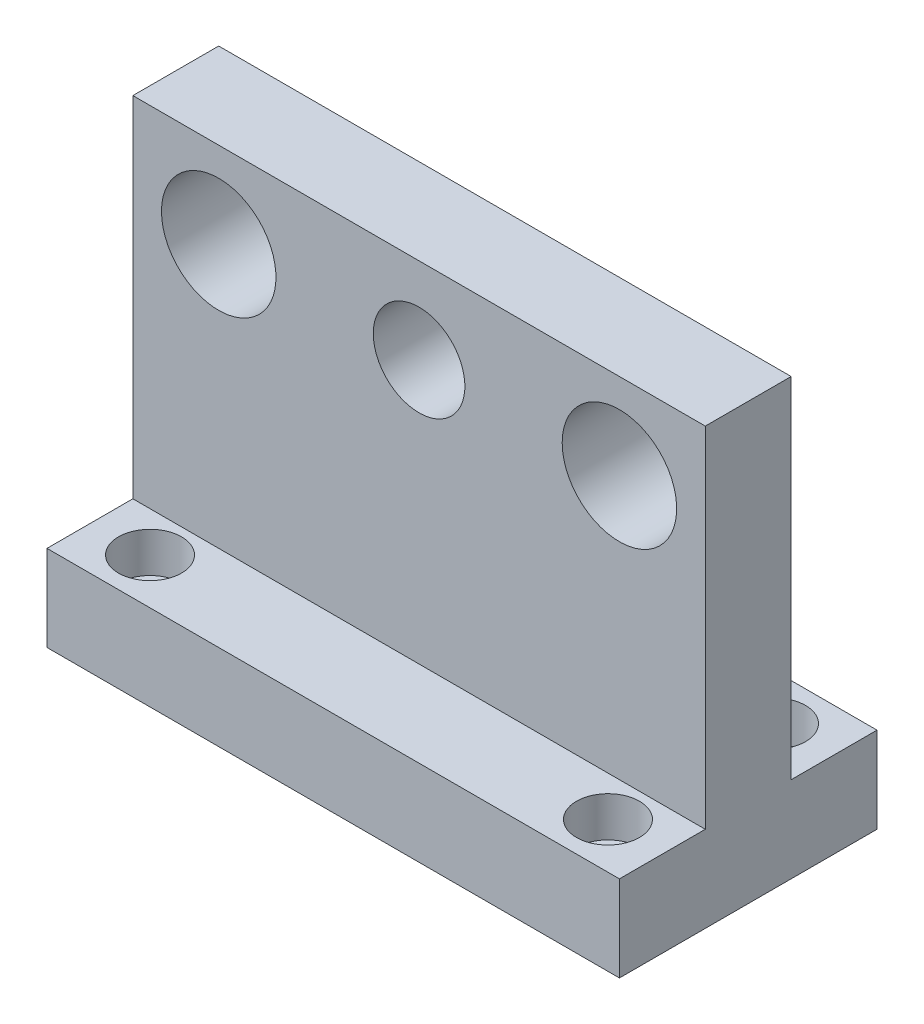
ISO-10303-21;
HEADER;
FILE_DESCRIPTION(('STEP AP214'),'2;1');
FILE_NAME('part.step','',(''),(''),'','','');
FILE_SCHEMA(('AUTOMOTIVE_DESIGN { 1 0 10303 214 1 1 1 1 }'));
ENDSEC;
DATA;
#1=APPLICATION_CONTEXT('core data for automotive mechanical design processes');
#2=APPLICATION_PROTOCOL_DEFINITION('international standard','automotive_design',2000,#1);
#3=PRODUCT_CONTEXT('',#1,'mechanical');
#4=PRODUCT('Part','Part','',(#3));
#5=PRODUCT_RELATED_PRODUCT_CATEGORY('part','',(#4));
#6=PRODUCT_DEFINITION_FORMATION('','',#4);
#7=PRODUCT_DEFINITION_CONTEXT('part definition',#1,'design');
#8=PRODUCT_DEFINITION('design','',#6,#7);
#9=PRODUCT_DEFINITION_SHAPE('','',#8);
#10=(LENGTH_UNIT() NAMED_UNIT(*) SI_UNIT(.MILLI.,.METRE.));
#11=(NAMED_UNIT(*) PLANE_ANGLE_UNIT() SI_UNIT($,.RADIAN.));
#12=(NAMED_UNIT(*) SI_UNIT($,.STERADIAN.) SOLID_ANGLE_UNIT());
#13=UNCERTAINTY_MEASURE_WITH_UNIT(LENGTH_MEASURE(1.E-05),#10,'distance_accuracy_value','');
#14=(GEOMETRIC_REPRESENTATION_CONTEXT(3) GLOBAL_UNCERTAINTY_ASSIGNED_CONTEXT((#13)) GLOBAL_UNIT_ASSIGNED_CONTEXT((#10,
#11,#12)) REPRESENTATION_CONTEXT('',''));
#15=CARTESIAN_POINT('',(0.,0.,0.));
#16=DIRECTION('',(0.,0.,1.));
#17=DIRECTION('',(1.,0.,0.));
#18=AXIS2_PLACEMENT_3D('',#15,#16,#17);
#19=CARTESIAN_POINT('',(90.,-15.,22.));
#20=DIRECTION('',(0.,1.,0.));
#21=DIRECTION('',(0.,0.,1.));
#22=AXIS2_PLACEMENT_3D('',#19,#20,#21);
#23=CYLINDRICAL_SURFACE('',#22,3.50000000000001);
#24=CARTESIAN_POINT('',(90.,-15.,22.));
#25=DIRECTION('',(0.,1.,0.));
#26=DIRECTION('',(0.,0.,-1.));
#27=AXIS2_PLACEMENT_3D('',#24,#25,#26);
#28=CIRCLE('',#27,3.50000000000001);
#29=CARTESIAN_POINT('',(90.,-15.,18.5));
#30=VERTEX_POINT('',#29);
#31=EDGE_CURVE('E247',#30,#30,#28,.T.);
#32=ORIENTED_EDGE('',*,*,#31,.F.);
#33=EDGE_LOOP('',(#32));
#34=FACE_BOUND('',#33,.T.);
#35=CARTESIAN_POINT('',(90.,-7.,22.));
#36=DIRECTION('',(0.,1.,0.));
#37=DIRECTION('',(0.,0.,1.));
#38=AXIS2_PLACEMENT_3D('',#35,#36,#37);
#39=CIRCLE('',#38,3.50000000000001);
#40=CARTESIAN_POINT('',(90.,-7.,25.5));
#41=VERTEX_POINT('',#40);
#42=EDGE_CURVE('E40',#41,#41,#39,.F.);
#43=ORIENTED_EDGE('',*,*,#42,.F.);
#44=EDGE_LOOP('',(#43));
#45=FACE_BOUND('',#44,.T.);
#46=ADVANCED_FACE('F36',(#34,#45),#23,.F.);
#47=CARTESIAN_POINT('',(10.,-15.,22.));
#48=DIRECTION('',(0.,1.,0.));
#49=DIRECTION('',(0.,0.,1.));
#50=AXIS2_PLACEMENT_3D('',#47,#48,#49);
#51=CYLINDRICAL_SURFACE('',#50,3.5);
#52=CARTESIAN_POINT('',(10.,-15.,22.));
#53=DIRECTION('',(0.,1.,0.));
#54=DIRECTION('',(0.,0.,-1.));
#55=AXIS2_PLACEMENT_3D('',#52,#53,#54);
#56=CIRCLE('',#55,3.5);
#57=CARTESIAN_POINT('',(10.,-15.,18.5));
#58=VERTEX_POINT('',#57);
#59=EDGE_CURVE('E244',#58,#58,#56,.T.);
#60=ORIENTED_EDGE('',*,*,#59,.F.);
#61=EDGE_LOOP('',(#60));
#62=FACE_BOUND('',#61,.T.);
#63=CARTESIAN_POINT('',(10.,-7.,22.));
#64=DIRECTION('',(0.,1.,0.));
#65=DIRECTION('',(0.,0.,1.));
#66=AXIS2_PLACEMENT_3D('',#63,#64,#65);
#67=CIRCLE('',#66,3.5);
#68=CARTESIAN_POINT('',(10.,-7.,25.5));
#69=VERTEX_POINT('',#68);
#70=EDGE_CURVE('E259',#69,#69,#67,.F.);
#71=ORIENTED_EDGE('',*,*,#70,.F.);
#72=EDGE_LOOP('',(#71));
#73=FACE_BOUND('',#72,.T.);
#74=ADVANCED_FACE('F216',(#62,#73),#51,.F.);
#75=CARTESIAN_POINT('',(90.,-15.,-7.));
#76=DIRECTION('',(0.,1.,0.));
#77=DIRECTION('',(0.,0.,1.));
#78=AXIS2_PLACEMENT_3D('',#75,#76,#77);
#79=CYLINDRICAL_SURFACE('',#78,3.50000000000001);
#80=CARTESIAN_POINT('',(90.,-15.,-7.));
#81=DIRECTION('',(0.,1.,0.));
#82=DIRECTION('',(0.,0.,1.));
#83=AXIS2_PLACEMENT_3D('',#80,#81,#82);
#84=CIRCLE('',#83,3.50000000000001);
#85=CARTESIAN_POINT('',(90.,-15.,-3.49999999999999));
#86=VERTEX_POINT('',#85);
#87=EDGE_CURVE('E283',#86,#86,#84,.T.);
#88=ORIENTED_EDGE('',*,*,#87,.F.);
#89=EDGE_LOOP('',(#88));
#90=FACE_BOUND('',#89,.T.);
#91=CARTESIAN_POINT('',(90.,-7.,-7.));
#92=DIRECTION('',(0.,1.,0.));
#93=DIRECTION('',(0.,0.,1.));
#94=AXIS2_PLACEMENT_3D('',#91,#92,#93);
#95=CIRCLE('',#94,3.50000000000001);
#96=CARTESIAN_POINT('',(90.,-7.,-3.49999999999999));
#97=VERTEX_POINT('',#96);
#98=EDGE_CURVE('E256',#97,#97,#95,.F.);
#99=ORIENTED_EDGE('',*,*,#98,.F.);
#100=EDGE_LOOP('',(#99));
#101=FACE_BOUND('',#100,.T.);
#102=ADVANCED_FACE('F222',(#90,#101),#79,.F.);
#103=CARTESIAN_POINT('',(10.,-15.,-7.));
#104=DIRECTION('',(0.,1.,0.));
#105=DIRECTION('',(0.,0.,1.));
#106=AXIS2_PLACEMENT_3D('',#103,#104,#105);
#107=CYLINDRICAL_SURFACE('',#106,3.5);
#108=CARTESIAN_POINT('',(10.,-15.,-7.));
#109=DIRECTION('',(0.,1.,0.));
#110=DIRECTION('',(0.,0.,1.));
#111=AXIS2_PLACEMENT_3D('',#108,#109,#110);
#112=CIRCLE('',#111,3.5);
#113=CARTESIAN_POINT('',(10.,-15.,-3.5));
#114=VERTEX_POINT('',#113);
#115=EDGE_CURVE('E178',#114,#114,#112,.T.);
#116=ORIENTED_EDGE('',*,*,#115,.F.);
#117=EDGE_LOOP('',(#116));
#118=FACE_BOUND('',#117,.T.);
#119=CARTESIAN_POINT('',(10.,-7.,-7.));
#120=DIRECTION('',(0.,1.,0.));
#121=DIRECTION('',(0.,0.,1.));
#122=AXIS2_PLACEMENT_3D('',#119,#120,#121);
#123=CIRCLE('',#122,3.5);
#124=CARTESIAN_POINT('',(10.,-7.,-3.5));
#125=VERTEX_POINT('',#124);
#126=EDGE_CURVE('E242',#125,#125,#123,.F.);
#127=ORIENTED_EDGE('',*,*,#126,.F.);
#128=EDGE_LOOP('',(#127));
#129=FACE_BOUND('',#128,.T.);
#130=ADVANCED_FACE('F230',(#118,#129),#107,.F.);
#131=CARTESIAN_POINT('',(0.,0.,15.));
#132=DIRECTION('',(1.,0.,0.));
#133=DIRECTION('',(0.,0.,-1.));
#134=AXIS2_PLACEMENT_3D('',#131,#132,#133);
#135=PLANE('',#134);
#136=DIRECTION('',(0.,-1.,0.));
#137=VECTOR('',#136,1.);
#138=CARTESIAN_POINT('',(0.,0.,0.));
#139=LINE('',#138,#137);
#140=CARTESIAN_POINT('',(0.,61.,0.));
#141=VERTEX_POINT('',#140);
#142=CARTESIAN_POINT('',(0.,0.,0.));
#143=VERTEX_POINT('',#142);
#144=EDGE_CURVE('E118',#141,#143,#139,.T.);
#145=ORIENTED_EDGE('',*,*,#144,.T.);
#146=DIRECTION('',(0.,0.,-1.));
#147=VECTOR('',#146,1.);
#148=CARTESIAN_POINT('',(0.,0.,30.));
#149=LINE('',#148,#147);
#150=CARTESIAN_POINT('',(0.,0.,-15.));
#151=VERTEX_POINT('',#150);
#152=EDGE_CURVE('E149',#143,#151,#149,.T.);
#153=ORIENTED_EDGE('',*,*,#152,.T.);
#154=DIRECTION('',(0.,1.,0.));
#155=VECTOR('',#154,1.);
#156=CARTESIAN_POINT('',(0.,-15.,-15.));
#157=LINE('',#156,#155);
#158=CARTESIAN_POINT('',(0.,-15.,-15.));
#159=VERTEX_POINT('',#158);
#160=EDGE_CURVE('E132',#159,#151,#157,.T.);
#161=ORIENTED_EDGE('',*,*,#160,.F.);
#162=DIRECTION('',(0.,0.,-1.));
#163=VECTOR('',#162,1.);
#164=CARTESIAN_POINT('',(0.,-15.,30.));
#165=LINE('',#164,#163);
#166=CARTESIAN_POINT('',(0.,-15.,30.));
#167=VERTEX_POINT('',#166);
#168=EDGE_CURVE('E162',#167,#159,#165,.T.);
#169=ORIENTED_EDGE('',*,*,#168,.F.);
#170=DIRECTION('',(0.,1.,0.));
#171=VECTOR('',#170,1.);
#172=CARTESIAN_POINT('',(0.,-15.,30.));
#173=LINE('',#172,#171);
#174=CARTESIAN_POINT('',(0.,0.,30.));
#175=VERTEX_POINT('',#174);
#176=EDGE_CURVE('E183',#167,#175,#173,.T.);
#177=ORIENTED_EDGE('',*,*,#176,.T.);
#178=CARTESIAN_POINT('',(0.,0.,15.));
#179=VERTEX_POINT('',#178);
#180=EDGE_CURVE('E146',#175,#179,#149,.T.);
#181=ORIENTED_EDGE('',*,*,#180,.T.);
#182=DIRECTION('',(0.,-1.,0.));
#183=VECTOR('',#182,1.);
#184=CARTESIAN_POINT('',(0.,0.,15.));
#185=LINE('',#184,#183);
#186=CARTESIAN_POINT('',(0.,61.,15.));
#187=VERTEX_POINT('',#186);
#188=EDGE_CURVE('E103',#187,#179,#185,.T.);
#189=ORIENTED_EDGE('',*,*,#188,.F.);
#190=DIRECTION('',(0.,0.,-1.));
#191=VECTOR('',#190,1.);
#192=CARTESIAN_POINT('',(0.,61.,15.));
#193=LINE('',#192,#191);
#194=EDGE_CURVE('E46',#187,#141,#193,.T.);
#195=ORIENTED_EDGE('',*,*,#194,.T.);
#196=EDGE_LOOP('',(#145,#153,#161,#169,#177,#181,#189,#195));
#197=FACE_BOUND('',#196,.T.);
#198=ADVANCED_FACE('F38',(#197),#135,.F.);
#199=CARTESIAN_POINT('',(100.,0.,15.));
#200=DIRECTION('',(-1.,0.,0.));
#201=DIRECTION('',(0.,0.,1.));
#202=AXIS2_PLACEMENT_3D('',#199,#200,#201);
#203=PLANE('',#202);
#204=DIRECTION('',(0.,1.,0.));
#205=VECTOR('',#204,1.);
#206=CARTESIAN_POINT('',(100.,0.,0.));
#207=LINE('',#206,#205);
#208=CARTESIAN_POINT('',(100.,0.,0.));
#209=VERTEX_POINT('',#208);
#210=CARTESIAN_POINT('',(100.,61.,0.));
#211=VERTEX_POINT('',#210);
#212=EDGE_CURVE('E67',#209,#211,#207,.T.);
#213=ORIENTED_EDGE('',*,*,#212,.T.);
#214=DIRECTION('',(0.,0.,-1.));
#215=VECTOR('',#214,1.);
#216=CARTESIAN_POINT('',(100.,61.,15.));
#217=LINE('',#216,#215);
#218=CARTESIAN_POINT('',(100.,61.,15.));
#219=VERTEX_POINT('',#218);
#220=EDGE_CURVE('E11',#219,#211,#217,.T.);
#221=ORIENTED_EDGE('',*,*,#220,.F.);
#222=DIRECTION('',(0.,1.,0.));
#223=VECTOR('',#222,1.);
#224=CARTESIAN_POINT('',(100.,0.,15.));
#225=LINE('',#224,#223);
#226=CARTESIAN_POINT('',(100.,0.,15.));
#227=VERTEX_POINT('',#226);
#228=EDGE_CURVE('E101',#227,#219,#225,.T.);
#229=ORIENTED_EDGE('',*,*,#228,.F.);
#230=DIRECTION('',(0.,0.,1.));
#231=VECTOR('',#230,1.);
#232=CARTESIAN_POINT('',(100.,0.,30.));
#233=LINE('',#232,#231);
#234=CARTESIAN_POINT('',(100.,0.,30.));
#235=VERTEX_POINT('',#234);
#236=EDGE_CURVE('E85',#227,#235,#233,.T.);
#237=ORIENTED_EDGE('',*,*,#236,.T.);
#238=DIRECTION('',(0.,1.,0.));
#239=VECTOR('',#238,1.);
#240=CARTESIAN_POINT('',(100.,-15.,30.));
#241=LINE('',#240,#239);
#242=CARTESIAN_POINT('',(100.,-15.,30.));
#243=VERTEX_POINT('',#242);
#244=EDGE_CURVE('E142',#243,#235,#241,.T.);
#245=ORIENTED_EDGE('',*,*,#244,.F.);
#246=DIRECTION('',(0.,0.,1.));
#247=VECTOR('',#246,1.);
#248=CARTESIAN_POINT('',(100.,-15.,30.));
#249=LINE('',#248,#247);
#250=CARTESIAN_POINT('',(100.,-15.,-15.));
#251=VERTEX_POINT('',#250);
#252=EDGE_CURVE('E175',#251,#243,#249,.T.);
#253=ORIENTED_EDGE('',*,*,#252,.F.);
#254=DIRECTION('',(0.,1.,0.));
#255=VECTOR('',#254,1.);
#256=CARTESIAN_POINT('',(100.,-15.,-15.));
#257=LINE('',#256,#255);
#258=CARTESIAN_POINT('',(100.,0.,-15.));
#259=VERTEX_POINT('',#258);
#260=EDGE_CURVE('E134',#251,#259,#257,.T.);
#261=ORIENTED_EDGE('',*,*,#260,.T.);
#262=EDGE_CURVE('E97',#259,#209,#233,.T.);
#263=ORIENTED_EDGE('',*,*,#262,.T.);
#264=EDGE_LOOP('',(#213,#221,#229,#237,#245,#253,#261,#263));
#265=FACE_BOUND('',#264,.T.);
#266=ADVANCED_FACE('F105',(#265),#203,.F.);
#267=CARTESIAN_POINT('',(0.,61.,15.));
#268=DIRECTION('',(0.,-1.,0.));
#269=DIRECTION('',(0.,0.,-1.));
#270=AXIS2_PLACEMENT_3D('',#267,#268,#269);
#271=PLANE('',#270);
#272=DIRECTION('',(-1.,0.,0.));
#273=VECTOR('',#272,1.);
#274=CARTESIAN_POINT('',(0.,61.,0.));
#275=LINE('',#274,#273);
#276=EDGE_CURVE('E113',#211,#141,#275,.T.);
#277=ORIENTED_EDGE('',*,*,#276,.T.);
#278=ORIENTED_EDGE('',*,*,#194,.F.);
#279=DIRECTION('',(-1.,0.,0.));
#280=VECTOR('',#279,1.);
#281=CARTESIAN_POINT('',(0.,61.,15.));
#282=LINE('',#281,#280);
#283=EDGE_CURVE('E55',#219,#187,#282,.T.);
#284=ORIENTED_EDGE('',*,*,#283,.F.);
#285=ORIENTED_EDGE('',*,*,#220,.T.);
#286=EDGE_LOOP('',(#277,#278,#284,#285));
#287=FACE_BOUND('',#286,.T.);
#288=ADVANCED_FACE('F302',(#287),#271,.F.);
#289=CARTESIAN_POINT('',(0.,0.,15.));
#290=DIRECTION('',(0.,0.,-1.));
#291=DIRECTION('',(-1.,0.,0.));
#292=AXIS2_PLACEMENT_3D('',#289,#290,#291);
#293=PLANE('',#292);
#294=CARTESIAN_POINT('',(50.,46.,15.));
#295=DIRECTION('',(0.,0.,-1.));
#296=DIRECTION('',(-1.,0.,0.));
#297=AXIS2_PLACEMENT_3D('',#294,#295,#296);
#298=CIRCLE('',#297,8.);
#299=CARTESIAN_POINT('',(42.,46.,15.));
#300=VERTEX_POINT('',#299);
#301=EDGE_CURVE('E552',#300,#300,#298,.T.);
#302=ORIENTED_EDGE('',*,*,#301,.T.);
#303=EDGE_LOOP('',(#302));
#304=FACE_BOUND('',#303,.T.);
#305=CARTESIAN_POINT('',(15.,46.,15.));
#306=DIRECTION('',(0.,0.,-1.));
#307=DIRECTION('',(-1.,0.,0.));
#308=AXIS2_PLACEMENT_3D('',#305,#306,#307);
#309=CIRCLE('',#308,10.);
#310=CARTESIAN_POINT('',(5.,46.,15.));
#311=VERTEX_POINT('',#310);
#312=EDGE_CURVE('E556',#311,#311,#309,.T.);
#313=ORIENTED_EDGE('',*,*,#312,.T.);
#314=EDGE_LOOP('',(#313));
#315=FACE_BOUND('',#314,.T.);
#316=CARTESIAN_POINT('',(85.,46.,15.));
#317=DIRECTION('',(0.,0.,-1.));
#318=DIRECTION('',(-1.,0.,0.));
#319=AXIS2_PLACEMENT_3D('',#316,#317,#318);
#320=CIRCLE('',#319,9.99999999999999);
#321=CARTESIAN_POINT('',(75.,46.,15.));
#322=VERTEX_POINT('',#321);
#323=EDGE_CURVE('E565',#322,#322,#320,.T.);
#324=ORIENTED_EDGE('',*,*,#323,.T.);
#325=EDGE_LOOP('',(#324));
#326=FACE_BOUND('',#325,.T.);
#327=ORIENTED_EDGE('',*,*,#188,.T.);
#328=DIRECTION('',(1.,0.,0.));
#329=VECTOR('',#328,1.);
#330=CARTESIAN_POINT('',(0.,0.,15.));
#331=LINE('',#330,#329);
#332=EDGE_CURVE('E89',#179,#227,#331,.T.);
#333=ORIENTED_EDGE('',*,*,#332,.T.);
#334=ORIENTED_EDGE('',*,*,#228,.T.);
#335=ORIENTED_EDGE('',*,*,#283,.T.);
#336=EDGE_LOOP('',(#327,#333,#334,#335));
#337=FACE_BOUND('',#336,.T.);
#338=ADVANCED_FACE('F100',(#304,#315,#326,#337),#293,.F.);
#339=CARTESIAN_POINT('',(0.,0.,0.));
#340=DIRECTION('',(0.,0.,-1.));
#341=DIRECTION('',(-1.,0.,0.));
#342=AXIS2_PLACEMENT_3D('',#339,#340,#341);
#343=PLANE('',#342);
#344=CARTESIAN_POINT('',(50.,46.,0.));
#345=DIRECTION('',(0.,0.,-1.));
#346=DIRECTION('',(-1.,0.,0.));
#347=AXIS2_PLACEMENT_3D('',#344,#345,#346);
#348=CIRCLE('',#347,8.);
#349=CARTESIAN_POINT('',(42.,46.,0.));
#350=VERTEX_POINT('',#349);
#351=EDGE_CURVE('E549',#350,#350,#348,.T.);
#352=ORIENTED_EDGE('',*,*,#351,.F.);
#353=EDGE_LOOP('',(#352));
#354=FACE_BOUND('',#353,.T.);
#355=CARTESIAN_POINT('',(15.,46.,0.));
#356=DIRECTION('',(0.,0.,-1.));
#357=DIRECTION('',(-1.,0.,0.));
#358=AXIS2_PLACEMENT_3D('',#355,#356,#357);
#359=CIRCLE('',#358,10.);
#360=CARTESIAN_POINT('',(5.,46.,0.));
#361=VERTEX_POINT('',#360);
#362=EDGE_CURVE('E553',#361,#361,#359,.T.);
#363=ORIENTED_EDGE('',*,*,#362,.F.);
#364=EDGE_LOOP('',(#363));
#365=FACE_BOUND('',#364,.T.);
#366=CARTESIAN_POINT('',(85.,46.,0.));
#367=DIRECTION('',(0.,0.,-1.));
#368=DIRECTION('',(-1.,0.,0.));
#369=AXIS2_PLACEMENT_3D('',#366,#367,#368);
#370=CIRCLE('',#369,9.99999999999999);
#371=CARTESIAN_POINT('',(75.,46.,0.));
#372=VERTEX_POINT('',#371);
#373=EDGE_CURVE('E562',#372,#372,#370,.T.);
#374=ORIENTED_EDGE('',*,*,#373,.F.);
#375=EDGE_LOOP('',(#374));
#376=FACE_BOUND('',#375,.T.);
#377=ORIENTED_EDGE('',*,*,#144,.F.);
#378=ORIENTED_EDGE('',*,*,#276,.F.);
#379=ORIENTED_EDGE('',*,*,#212,.F.);
#380=DIRECTION('',(1.,0.,0.));
#381=VECTOR('',#380,1.);
#382=CARTESIAN_POINT('',(0.,0.,0.));
#383=LINE('',#382,#381);
#384=EDGE_CURVE('E76',#143,#209,#383,.T.);
#385=ORIENTED_EDGE('',*,*,#384,.F.);
#386=EDGE_LOOP('',(#377,#378,#379,#385));
#387=FACE_BOUND('',#386,.T.);
#388=ADVANCED_FACE('F131',(#354,#365,#376,#387),#343,.T.);
#389=CARTESIAN_POINT('',(0.,0.,0.));
#390=DIRECTION('',(0.,-1.,0.));
#391=DIRECTION('',(0.,0.,-1.));
#392=AXIS2_PLACEMENT_3D('',#389,#390,#391);
#393=PLANE('',#392);
#394=CARTESIAN_POINT('',(90.,0.,-7.));
#395=DIRECTION('',(0.,1.,0.));
#396=DIRECTION('',(0.,0.,1.));
#397=AXIS2_PLACEMENT_3D('',#394,#395,#396);
#398=CIRCLE('',#397,5.5);
#399=CARTESIAN_POINT('',(90.,0.,-1.5));
#400=VERTEX_POINT('',#399);
#401=EDGE_CURVE('E261',#400,#400,#398,.T.);
#402=ORIENTED_EDGE('',*,*,#401,.F.);
#403=EDGE_LOOP('',(#402));
#404=FACE_BOUND('',#403,.T.);
#405=CARTESIAN_POINT('',(10.,0.,-7.));
#406=DIRECTION('',(0.,1.,0.));
#407=DIRECTION('',(0.,0.,1.));
#408=AXIS2_PLACEMENT_3D('',#405,#406,#407);
#409=CIRCLE('',#408,5.5);
#410=CARTESIAN_POINT('',(10.,0.,-1.5));
#411=VERTEX_POINT('',#410);
#412=EDGE_CURVE('E250',#411,#411,#409,.T.);
#413=ORIENTED_EDGE('',*,*,#412,.F.);
#414=EDGE_LOOP('',(#413));
#415=FACE_BOUND('',#414,.T.);
#416=ORIENTED_EDGE('',*,*,#152,.F.);
#417=ORIENTED_EDGE('',*,*,#384,.T.);
#418=ORIENTED_EDGE('',*,*,#262,.F.);
#419=DIRECTION('',(1.,0.,0.));
#420=VECTOR('',#419,1.);
#421=CARTESIAN_POINT('',(0.,0.,-15.));
#422=LINE('',#421,#420);
#423=EDGE_CURVE('E98',#151,#259,#422,.T.);
#424=ORIENTED_EDGE('',*,*,#423,.F.);
#425=EDGE_LOOP('',(#416,#417,#418,#424));
#426=FACE_BOUND('',#425,.T.);
#427=ADVANCED_FACE('F210',(#404,#415,#426),#393,.F.);
#428=CARTESIAN_POINT('',(0.,-15.,-15.));
#429=DIRECTION('',(0.,0.,1.));
#430=DIRECTION('',(1.,0.,0.));
#431=AXIS2_PLACEMENT_3D('',#428,#429,#430);
#432=PLANE('',#431);
#433=ORIENTED_EDGE('',*,*,#423,.T.);
#434=ORIENTED_EDGE('',*,*,#260,.F.);
#435=DIRECTION('',(1.,0.,0.));
#436=VECTOR('',#435,1.);
#437=CARTESIAN_POINT('',(0.,-15.,-15.));
#438=LINE('',#437,#436);
#439=EDGE_CURVE('E168',#159,#251,#438,.T.);
#440=ORIENTED_EDGE('',*,*,#439,.F.);
#441=ORIENTED_EDGE('',*,*,#160,.T.);
#442=EDGE_LOOP('',(#433,#434,#440,#441));
#443=FACE_BOUND('',#442,.T.);
#444=ADVANCED_FACE('F198',(#443),#432,.F.);
#445=CARTESIAN_POINT('',(0.,-15.,30.));
#446=DIRECTION('',(0.,0.,-1.));
#447=DIRECTION('',(-1.,0.,0.));
#448=AXIS2_PLACEMENT_3D('',#445,#446,#447);
#449=PLANE('',#448);
#450=DIRECTION('',(-1.,0.,0.));
#451=VECTOR('',#450,1.);
#452=CARTESIAN_POINT('',(0.,0.,30.));
#453=LINE('',#452,#451);
#454=EDGE_CURVE('E93',#235,#175,#453,.T.);
#455=ORIENTED_EDGE('',*,*,#454,.T.);
#456=ORIENTED_EDGE('',*,*,#176,.F.);
#457=DIRECTION('',(-1.,0.,0.));
#458=VECTOR('',#457,1.);
#459=CARTESIAN_POINT('',(0.,-15.,30.));
#460=LINE('',#459,#458);
#461=EDGE_CURVE('E154',#243,#167,#460,.T.);
#462=ORIENTED_EDGE('',*,*,#461,.F.);
#463=ORIENTED_EDGE('',*,*,#244,.T.);
#464=EDGE_LOOP('',(#455,#456,#462,#463));
#465=FACE_BOUND('',#464,.T.);
#466=ADVANCED_FACE('F186',(#465),#449,.F.);
#467=CARTESIAN_POINT('',(0.,-15.,0.));
#468=DIRECTION('',(0.,-1.,0.));
#469=DIRECTION('',(0.,0.,-1.));
#470=AXIS2_PLACEMENT_3D('',#467,#468,#469);
#471=PLANE('',#470);
#472=ORIENTED_EDGE('',*,*,#59,.T.);
#473=EDGE_LOOP('',(#472));
#474=FACE_BOUND('',#473,.T.);
#475=ORIENTED_EDGE('',*,*,#31,.T.);
#476=EDGE_LOOP('',(#475));
#477=FACE_BOUND('',#476,.T.);
#478=ORIENTED_EDGE('',*,*,#87,.T.);
#479=EDGE_LOOP('',(#478));
#480=FACE_BOUND('',#479,.T.);
#481=ORIENTED_EDGE('',*,*,#115,.T.);
#482=EDGE_LOOP('',(#481));
#483=FACE_BOUND('',#482,.T.);
#484=ORIENTED_EDGE('',*,*,#168,.T.);
#485=ORIENTED_EDGE('',*,*,#439,.T.);
#486=ORIENTED_EDGE('',*,*,#252,.T.);
#487=ORIENTED_EDGE('',*,*,#461,.T.);
#488=EDGE_LOOP('',(#484,#485,#486,#487));
#489=FACE_BOUND('',#488,.T.);
#490=ADVANCED_FACE('F199',(#474,#477,#480,#483,#489),#471,.T.);
#491=CARTESIAN_POINT('',(90.,0.,22.));
#492=DIRECTION('',(0.,1.,0.));
#493=DIRECTION('',(0.,0.,1.));
#494=AXIS2_PLACEMENT_3D('',#491,#492,#493);
#495=CIRCLE('',#494,5.5);
#496=CARTESIAN_POINT('',(90.,0.,27.5));
#497=VERTEX_POINT('',#496);
#498=EDGE_CURVE('E275',#497,#497,#495,.T.);
#499=ORIENTED_EDGE('',*,*,#498,.F.);
#500=EDGE_LOOP('',(#499));
#501=FACE_BOUND('',#500,.T.);
#502=CARTESIAN_POINT('',(10.,0.,22.));
#503=DIRECTION('',(0.,1.,0.));
#504=DIRECTION('',(0.,0.,1.));
#505=AXIS2_PLACEMENT_3D('',#502,#503,#504);
#506=CIRCLE('',#505,5.5);
#507=CARTESIAN_POINT('',(10.,0.,27.5));
#508=VERTEX_POINT('',#507);
#509=EDGE_CURVE('E268',#508,#508,#506,.T.);
#510=ORIENTED_EDGE('',*,*,#509,.F.);
#511=EDGE_LOOP('',(#510));
#512=FACE_BOUND('',#511,.T.);
#513=ORIENTED_EDGE('',*,*,#332,.F.);
#514=ORIENTED_EDGE('',*,*,#180,.F.);
#515=ORIENTED_EDGE('',*,*,#454,.F.);
#516=ORIENTED_EDGE('',*,*,#236,.F.);
#517=EDGE_LOOP('',(#513,#514,#515,#516));
#518=FACE_BOUND('',#517,.T.);
#519=ADVANCED_FACE('F87',(#501,#512,#518),#393,.F.);
#520=CARTESIAN_POINT('',(10.,-7.,-7.));
#521=DIRECTION('',(0.,1.,0.));
#522=DIRECTION('',(0.,0.,1.));
#523=AXIS2_PLACEMENT_3D('',#520,#521,#522);
#524=PLANE('',#523);
#525=CARTESIAN_POINT('',(10.,-7.,-7.));
#526=DIRECTION('',(0.,1.,0.));
#527=DIRECTION('',(0.,0.,1.));
#528=AXIS2_PLACEMENT_3D('',#525,#526,#527);
#529=CIRCLE('',#528,5.5);
#530=CARTESIAN_POINT('',(10.,-7.,-1.5));
#531=VERTEX_POINT('',#530);
#532=EDGE_CURVE('E245',#531,#531,#529,.T.);
#533=ORIENTED_EDGE('',*,*,#532,.T.);
#534=EDGE_LOOP('',(#533));
#535=FACE_BOUND('',#534,.T.);
#536=ORIENTED_EDGE('',*,*,#126,.T.);
#537=EDGE_LOOP('',(#536));
#538=FACE_BOUND('',#537,.T.);
#539=ADVANCED_FACE('F207',(#535,#538),#524,.T.);
#540=CARTESIAN_POINT('',(10.,-7.,-7.));
#541=DIRECTION('',(0.,1.,0.));
#542=DIRECTION('',(0.,0.,1.));
#543=AXIS2_PLACEMENT_3D('',#540,#541,#542);
#544=CYLINDRICAL_SURFACE('',#543,5.5);
#545=ORIENTED_EDGE('',*,*,#532,.F.);
#546=EDGE_LOOP('',(#545));
#547=FACE_BOUND('',#546,.T.);
#548=ORIENTED_EDGE('',*,*,#412,.T.);
#549=EDGE_LOOP('',(#548));
#550=FACE_BOUND('',#549,.T.);
#551=ADVANCED_FACE('F361',(#547,#550),#544,.F.);
#552=CARTESIAN_POINT('',(90.,-7.,-7.));
#553=DIRECTION('',(0.,1.,0.));
#554=DIRECTION('',(0.,0.,1.));
#555=AXIS2_PLACEMENT_3D('',#552,#553,#554);
#556=PLANE('',#555);
#557=CARTESIAN_POINT('',(90.,-7.,-7.));
#558=DIRECTION('',(0.,1.,0.));
#559=DIRECTION('',(0.,0.,1.));
#560=AXIS2_PLACEMENT_3D('',#557,#558,#559);
#561=CIRCLE('',#560,5.5);
#562=CARTESIAN_POINT('',(90.,-7.,-1.5));
#563=VERTEX_POINT('',#562);
#564=EDGE_CURVE('E258',#563,#563,#561,.T.);
#565=ORIENTED_EDGE('',*,*,#564,.T.);
#566=EDGE_LOOP('',(#565));
#567=FACE_BOUND('',#566,.T.);
#568=ORIENTED_EDGE('',*,*,#98,.T.);
#569=EDGE_LOOP('',(#568));
#570=FACE_BOUND('',#569,.T.);
#571=ADVANCED_FACE('F371',(#567,#570),#556,.T.);
#572=CARTESIAN_POINT('',(90.,-7.,-7.));
#573=DIRECTION('',(0.,1.,0.));
#574=DIRECTION('',(0.,0.,1.));
#575=AXIS2_PLACEMENT_3D('',#572,#573,#574);
#576=CYLINDRICAL_SURFACE('',#575,5.5);
#577=ORIENTED_EDGE('',*,*,#564,.F.);
#578=EDGE_LOOP('',(#577));
#579=FACE_BOUND('',#578,.T.);
#580=ORIENTED_EDGE('',*,*,#401,.T.);
#581=EDGE_LOOP('',(#580));
#582=FACE_BOUND('',#581,.T.);
#583=ADVANCED_FACE('F380',(#579,#582),#576,.F.);
#584=CARTESIAN_POINT('',(10.,-7.,22.));
#585=DIRECTION('',(0.,1.,0.));
#586=DIRECTION('',(0.,0.,1.));
#587=AXIS2_PLACEMENT_3D('',#584,#585,#586);
#588=PLANE('',#587);
#589=CARTESIAN_POINT('',(10.,-7.,22.));
#590=DIRECTION('',(0.,1.,0.));
#591=DIRECTION('',(0.,0.,1.));
#592=AXIS2_PLACEMENT_3D('',#589,#590,#591);
#593=CIRCLE('',#592,5.5);
#594=CARTESIAN_POINT('',(10.,-7.,27.5));
#595=VERTEX_POINT('',#594);
#596=EDGE_CURVE('E262',#595,#595,#593,.T.);
#597=ORIENTED_EDGE('',*,*,#596,.T.);
#598=EDGE_LOOP('',(#597));
#599=FACE_BOUND('',#598,.T.);
#600=ORIENTED_EDGE('',*,*,#70,.T.);
#601=EDGE_LOOP('',(#600));
#602=FACE_BOUND('',#601,.T.);
#603=ADVANCED_FACE('F390',(#599,#602),#588,.T.);
#604=CARTESIAN_POINT('',(10.,-7.,22.));
#605=DIRECTION('',(0.,1.,0.));
#606=DIRECTION('',(0.,0.,1.));
#607=AXIS2_PLACEMENT_3D('',#604,#605,#606);
#608=CYLINDRICAL_SURFACE('',#607,5.5);
#609=ORIENTED_EDGE('',*,*,#596,.F.);
#610=EDGE_LOOP('',(#609));
#611=FACE_BOUND('',#610,.T.);
#612=ORIENTED_EDGE('',*,*,#509,.T.);
#613=EDGE_LOOP('',(#612));
#614=FACE_BOUND('',#613,.T.);
#615=ADVANCED_FACE('F400',(#611,#614),#608,.F.);
#616=CARTESIAN_POINT('',(90.,-7.,22.));
#617=DIRECTION('',(0.,1.,0.));
#618=DIRECTION('',(0.,0.,1.));
#619=AXIS2_PLACEMENT_3D('',#616,#617,#618);
#620=PLANE('',#619);
#621=CARTESIAN_POINT('',(90.,-7.,22.));
#622=DIRECTION('',(0.,1.,0.));
#623=DIRECTION('',(0.,0.,1.));
#624=AXIS2_PLACEMENT_3D('',#621,#622,#623);
#625=CIRCLE('',#624,5.5);
#626=CARTESIAN_POINT('',(90.,-7.,27.5));
#627=VERTEX_POINT('',#626);
#628=EDGE_CURVE('E567',#627,#627,#625,.T.);
#629=ORIENTED_EDGE('',*,*,#628,.T.);
#630=EDGE_LOOP('',(#629));
#631=FACE_BOUND('',#630,.T.);
#632=ORIENTED_EDGE('',*,*,#42,.T.);
#633=EDGE_LOOP('',(#632));
#634=FACE_BOUND('',#633,.T.);
#635=ADVANCED_FACE('F409',(#631,#634),#620,.T.);
#636=CARTESIAN_POINT('',(90.,-7.,22.));
#637=DIRECTION('',(0.,1.,0.));
#638=DIRECTION('',(0.,0.,1.));
#639=AXIS2_PLACEMENT_3D('',#636,#637,#638);
#640=CYLINDRICAL_SURFACE('',#639,5.5);
#641=ORIENTED_EDGE('',*,*,#628,.F.);
#642=EDGE_LOOP('',(#641));
#643=FACE_BOUND('',#642,.T.);
#644=ORIENTED_EDGE('',*,*,#498,.T.);
#645=EDGE_LOOP('',(#644));
#646=FACE_BOUND('',#645,.T.);
#647=ADVANCED_FACE('F419',(#643,#646),#640,.F.);
#648=CARTESIAN_POINT('',(85.,46.,30.000025));
#649=DIRECTION('',(0.,0.,-1.));
#650=DIRECTION('',(-1.,0.,0.));
#651=AXIS2_PLACEMENT_3D('',#648,#649,#650);
#652=CYLINDRICAL_SURFACE('',#651,9.99999999999999);
#653=ORIENTED_EDGE('',*,*,#373,.T.);
#654=EDGE_LOOP('',(#653));
#655=FACE_BOUND('',#654,.T.);
#656=ORIENTED_EDGE('',*,*,#323,.F.);
#657=EDGE_LOOP('',(#656));
#658=FACE_BOUND('',#657,.T.);
#659=ADVANCED_FACE('F429',(#655,#658),#652,.F.);
#660=CARTESIAN_POINT('',(15.,46.,30.000025));
#661=DIRECTION('',(0.,0.,-1.));
#662=DIRECTION('',(-1.,0.,0.));
#663=AXIS2_PLACEMENT_3D('',#660,#661,#662);
#664=CYLINDRICAL_SURFACE('',#663,10.);
#665=ORIENTED_EDGE('',*,*,#362,.T.);
#666=EDGE_LOOP('',(#665));
#667=FACE_BOUND('',#666,.T.);
#668=ORIENTED_EDGE('',*,*,#312,.F.);
#669=EDGE_LOOP('',(#668));
#670=FACE_BOUND('',#669,.T.);
#671=ADVANCED_FACE('F438',(#667,#670),#664,.F.);
#672=CARTESIAN_POINT('',(50.,46.,30.000025));
#673=DIRECTION('',(0.,0.,-1.));
#674=DIRECTION('',(-1.,0.,0.));
#675=AXIS2_PLACEMENT_3D('',#672,#673,#674);
#676=CYLINDRICAL_SURFACE('',#675,8.);
#677=ORIENTED_EDGE('',*,*,#351,.T.);
#678=EDGE_LOOP('',(#677));
#679=FACE_BOUND('',#678,.T.);
#680=ORIENTED_EDGE('',*,*,#301,.F.);
#681=EDGE_LOOP('',(#680));
#682=FACE_BOUND('',#681,.T.);
#683=ADVANCED_FACE('F447',(#679,#682),#676,.F.);
#684=CLOSED_SHELL('',(#46,#74,#102,#130,#198,#266,#288,#338,#388,#427,#444,#466,#490,#519,#539,
#551,#571,#583,#603,#615,#635,#647,#659,#671,#683));
#685=MANIFOLD_SOLID_BREP('B2',#684);
#686=ADVANCED_BREP_SHAPE_REPRESENTATION('',(#18,#685),#14);
#687=SHAPE_DEFINITION_REPRESENTATION(#9,#686);
ENDSEC;
END-ISO-10303-21;
